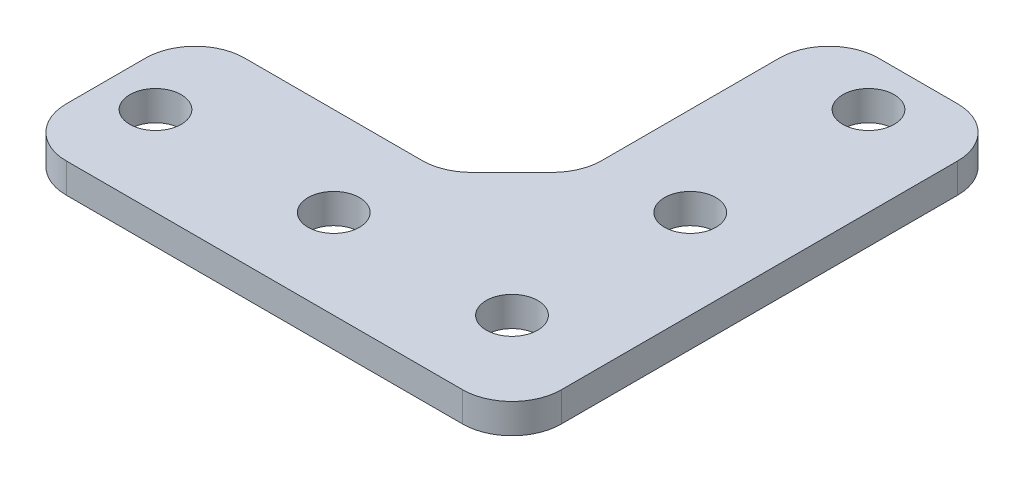
ISO-10303-21;
HEADER;
FILE_DESCRIPTION(('STEP AP214'),'2;1');
FILE_NAME('part.step','',(''),(''),'','','');
FILE_SCHEMA(('AUTOMOTIVE_DESIGN { 1 0 10303 214 1 1 1 1 }'));
ENDSEC;
DATA;
#1=APPLICATION_CONTEXT('core data for automotive mechanical design processes');
#2=APPLICATION_PROTOCOL_DEFINITION('international standard','automotive_design',2000,#1);
#3=PRODUCT_CONTEXT('',#1,'mechanical');
#4=PRODUCT('Part','Part','',(#3));
#5=PRODUCT_RELATED_PRODUCT_CATEGORY('part','',(#4));
#6=PRODUCT_DEFINITION_FORMATION('','',#4);
#7=PRODUCT_DEFINITION_CONTEXT('part definition',#1,'design');
#8=PRODUCT_DEFINITION('design','',#6,#7);
#9=PRODUCT_DEFINITION_SHAPE('','',#8);
#10=(LENGTH_UNIT() NAMED_UNIT(*) SI_UNIT(.MILLI.,.METRE.));
#11=(NAMED_UNIT(*) PLANE_ANGLE_UNIT() SI_UNIT($,.RADIAN.));
#12=(NAMED_UNIT(*) SI_UNIT($,.STERADIAN.) SOLID_ANGLE_UNIT());
#13=UNCERTAINTY_MEASURE_WITH_UNIT(LENGTH_MEASURE(1.E-05),#10,'distance_accuracy_value','');
#14=(GEOMETRIC_REPRESENTATION_CONTEXT(3) GLOBAL_UNCERTAINTY_ASSIGNED_CONTEXT((#13)) GLOBAL_UNIT_ASSIGNED_CONTEXT((#10,
#11,#12)) REPRESENTATION_CONTEXT('',''));
#15=CARTESIAN_POINT('',(0.,0.,0.));
#16=DIRECTION('',(0.,0.,1.));
#17=DIRECTION('',(1.,0.,0.));
#18=AXIS2_PLACEMENT_3D('',#15,#16,#17);
#19=CARTESIAN_POINT('',(25.,-3.,-25.));
#20=DIRECTION('',(1.,0.,0.));
#21=DIRECTION('',(0.,0.,-1.));
#22=AXIS2_PLACEMENT_3D('',#19,#20,#21);
#23=PLANE('',#22);
#24=DIRECTION('',(0.,0.,-1.));
#25=VECTOR('',#24,1.);
#26=CARTESIAN_POINT('',(25.,-3.,-25.));
#27=LINE('',#26,#25);
#28=CARTESIAN_POINT('',(25.,-3.,20.));
#29=VERTEX_POINT('',#28);
#30=CARTESIAN_POINT('',(25.,-3.,-20.));
#31=VERTEX_POINT('',#30);
#32=EDGE_CURVE('E243',#29,#31,#27,.T.);
#33=ORIENTED_EDGE('',*,*,#32,.T.);
#34=DIRECTION('',(0.,1.,0.));
#35=VECTOR('',#34,1.);
#36=CARTESIAN_POINT('',(25.,-3.,-20.));
#37=LINE('',#36,#35);
#38=CARTESIAN_POINT('',(25.,0.,-20.));
#39=VERTEX_POINT('',#38);
#40=EDGE_CURVE('E222',#31,#39,#37,.T.);
#41=ORIENTED_EDGE('',*,*,#40,.T.);
#42=DIRECTION('',(0.,0.,-1.));
#43=VECTOR('',#42,1.);
#44=CARTESIAN_POINT('',(25.,0.,-25.));
#45=LINE('',#44,#43);
#46=CARTESIAN_POINT('',(25.,0.,20.));
#47=VERTEX_POINT('',#46);
#48=EDGE_CURVE('E248',#47,#39,#45,.T.);
#49=ORIENTED_EDGE('',*,*,#48,.F.);
#50=DIRECTION('',(0.,1.,0.));
#51=VECTOR('',#50,1.);
#52=CARTESIAN_POINT('',(25.,-3.,20.));
#53=LINE('',#52,#51);
#54=EDGE_CURVE('E220',#47,#29,#53,.F.);
#55=ORIENTED_EDGE('',*,*,#54,.T.);
#56=EDGE_LOOP('',(#33,#41,#49,#55));
#57=FACE_BOUND('',#56,.T.);
#58=ADVANCED_FACE('F39',(#57),#23,.T.);
#59=CARTESIAN_POINT('',(-25.,-3.,25.));
#60=DIRECTION('',(0.,0.,1.));
#61=DIRECTION('',(1.,0.,0.));
#62=AXIS2_PLACEMENT_3D('',#59,#60,#61);
#63=PLANE('',#62);
#64=DIRECTION('',(1.,0.,0.));
#65=VECTOR('',#64,1.);
#66=CARTESIAN_POINT('',(-25.,-3.,25.));
#67=LINE('',#66,#65);
#68=CARTESIAN_POINT('',(-20.,-3.,25.));
#69=VERTEX_POINT('',#68);
#70=CARTESIAN_POINT('',(20.,-3.,25.));
#71=VERTEX_POINT('',#70);
#72=EDGE_CURVE('E170',#69,#71,#67,.T.);
#73=ORIENTED_EDGE('',*,*,#72,.T.);
#74=DIRECTION('',(0.,1.,0.));
#75=VECTOR('',#74,1.);
#76=CARTESIAN_POINT('',(20.,-3.,25.));
#77=LINE('',#76,#75);
#78=CARTESIAN_POINT('',(20.,0.,25.));
#79=VERTEX_POINT('',#78);
#80=EDGE_CURVE('E11',#71,#79,#77,.T.);
#81=ORIENTED_EDGE('',*,*,#80,.T.);
#82=DIRECTION('',(1.,0.,0.));
#83=VECTOR('',#82,1.);
#84=CARTESIAN_POINT('',(-25.,0.,25.));
#85=LINE('',#84,#83);
#86=CARTESIAN_POINT('',(-20.,0.,25.));
#87=VERTEX_POINT('',#86);
#88=EDGE_CURVE('E178',#87,#79,#85,.T.);
#89=ORIENTED_EDGE('',*,*,#88,.F.);
#90=DIRECTION('',(0.,1.,0.));
#91=VECTOR('',#90,1.);
#92=CARTESIAN_POINT('',(-20.,-3.,25.));
#93=LINE('',#92,#91);
#94=EDGE_CURVE('E47',#87,#69,#93,.F.);
#95=ORIENTED_EDGE('',*,*,#94,.T.);
#96=EDGE_LOOP('',(#73,#81,#89,#95));
#97=FACE_BOUND('',#96,.T.);
#98=ADVANCED_FACE('F227',(#97),#63,.T.);
#99=CARTESIAN_POINT('',(-25.,-3.,7.00000000000002));
#100=DIRECTION('',(-1.,0.,0.));
#101=DIRECTION('',(0.,0.,1.));
#102=AXIS2_PLACEMENT_3D('',#99,#100,#101);
#103=PLANE('',#102);
#104=DIRECTION('',(0.,0.,1.));
#105=VECTOR('',#104,1.);
#106=CARTESIAN_POINT('',(-25.,0.,7.00000000000002));
#107=LINE('',#106,#105);
#108=CARTESIAN_POINT('',(-25.,0.,12.));
#109=VERTEX_POINT('',#108);
#110=CARTESIAN_POINT('',(-25.,0.,20.));
#111=VERTEX_POINT('',#110);
#112=EDGE_CURVE('E239',#109,#111,#107,.T.);
#113=ORIENTED_EDGE('',*,*,#112,.F.);
#114=DIRECTION('',(0.,1.,0.));
#115=VECTOR('',#114,1.);
#116=CARTESIAN_POINT('',(-25.,-3.,12.));
#117=LINE('',#116,#115);
#118=CARTESIAN_POINT('',(-25.,-3.,12.));
#119=VERTEX_POINT('',#118);
#120=EDGE_CURVE('E218',#109,#119,#117,.F.);
#121=ORIENTED_EDGE('',*,*,#120,.T.);
#122=DIRECTION('',(0.,0.,1.));
#123=VECTOR('',#122,1.);
#124=CARTESIAN_POINT('',(-25.,-3.,7.00000000000002));
#125=LINE('',#124,#123);
#126=CARTESIAN_POINT('',(-25.,-3.,20.));
#127=VERTEX_POINT('',#126);
#128=EDGE_CURVE('E175',#119,#127,#125,.T.);
#129=ORIENTED_EDGE('',*,*,#128,.T.);
#130=DIRECTION('',(0.,1.,0.));
#131=VECTOR('',#130,1.);
#132=CARTESIAN_POINT('',(-25.,-3.,20.));
#133=LINE('',#132,#131);
#134=EDGE_CURVE('E215',#127,#111,#133,.T.);
#135=ORIENTED_EDGE('',*,*,#134,.T.);
#136=EDGE_LOOP('',(#113,#121,#129,#135));
#137=FACE_BOUND('',#136,.T.);
#138=ADVANCED_FACE('F238',(#137),#103,.T.);
#139=CARTESIAN_POINT('',(3.47658860459488E-13,-3.,7.00000000000002));
#140=DIRECTION('',(0.,0.,-1.));
#141=DIRECTION('',(-1.,0.,0.));
#142=AXIS2_PLACEMENT_3D('',#139,#140,#141);
#143=PLANE('',#142);
#144=DIRECTION('',(-1.,0.,0.));
#145=VECTOR('',#144,1.);
#146=CARTESIAN_POINT('',(3.47658860459488E-13,-3.,7.00000000000002));
#147=LINE('',#146,#145);
#148=CARTESIAN_POINT('',(-2.0710678118652,-3.,7.00000000000002));
#149=VERTEX_POINT('',#148);
#150=CARTESIAN_POINT('',(-20.,-3.,7.00000000000002));
#151=VERTEX_POINT('',#150);
#152=EDGE_CURVE('E253',#149,#151,#147,.T.);
#153=ORIENTED_EDGE('',*,*,#152,.T.);
#154=DIRECTION('',(0.,1.,0.));
#155=VECTOR('',#154,1.);
#156=CARTESIAN_POINT('',(-20.,-3.,7.00000000000002));
#157=LINE('',#156,#155);
#158=CARTESIAN_POINT('',(-20.,0.,7.00000000000002));
#159=VERTEX_POINT('',#158);
#160=EDGE_CURVE('E212',#151,#159,#157,.T.);
#161=ORIENTED_EDGE('',*,*,#160,.T.);
#162=DIRECTION('',(-1.,0.,0.));
#163=VECTOR('',#162,1.);
#164=CARTESIAN_POINT('',(3.47658860459488E-13,0.,7.00000000000002));
#165=LINE('',#164,#163);
#166=CARTESIAN_POINT('',(-2.0710678118652,0.,7.00000000000002));
#167=VERTEX_POINT('',#166);
#168=EDGE_CURVE('E242',#167,#159,#165,.T.);
#169=ORIENTED_EDGE('',*,*,#168,.F.);
#170=DIRECTION('',(0.,1.,0.));
#171=VECTOR('',#170,1.);
#172=CARTESIAN_POINT('',(-2.0710678118652,-3.,7.00000000000002));
#173=LINE('',#172,#171);
#174=EDGE_CURVE('E163',#167,#149,#173,.F.);
#175=ORIENTED_EDGE('',*,*,#174,.T.);
#176=EDGE_LOOP('',(#153,#161,#169,#175));
#177=FACE_BOUND('',#176,.T.);
#178=ADVANCED_FACE('F379',(#177),#143,.T.);
#179=CARTESIAN_POINT('',(6.99999999999999,-3.,0.));
#180=DIRECTION('',(-0.707106781186566,0.,-0.707106781186529));
#181=DIRECTION('',(-0.707106781186529,0.,0.707106781186566));
#182=AXIS2_PLACEMENT_3D('',#179,#180,#181);
#183=PLANE('',#182);
#184=DIRECTION('',(-0.707106781186529,0.,0.707106781186566));
#185=VECTOR('',#184,1.);
#186=CARTESIAN_POINT('',(6.99999999999999,0.,0.));
#187=LINE('',#186,#185);
#188=CARTESIAN_POINT('',(5.53553390593282,0.,1.46446609406726));
#189=VERTEX_POINT('',#188);
#190=CARTESIAN_POINT('',(1.46446609406762,0.,5.53553390593266));
#191=VERTEX_POINT('',#190);
#192=EDGE_CURVE('E152',#189,#191,#187,.T.);
#193=ORIENTED_EDGE('',*,*,#192,.F.);
#194=DIRECTION('',(0.,1.,0.));
#195=VECTOR('',#194,1.);
#196=CARTESIAN_POINT('',(5.53553390593282,-3.,1.46446609406726));
#197=LINE('',#196,#195);
#198=CARTESIAN_POINT('',(5.53553390593282,-3.,1.46446609406726));
#199=VERTEX_POINT('',#198);
#200=EDGE_CURVE('E161',#189,#199,#197,.F.);
#201=ORIENTED_EDGE('',*,*,#200,.T.);
#202=DIRECTION('',(-0.707106781186529,0.,0.707106781186566));
#203=VECTOR('',#202,1.);
#204=CARTESIAN_POINT('',(6.99999999999999,-3.,0.));
#205=LINE('',#204,#203);
#206=CARTESIAN_POINT('',(1.46446609406762,-3.,5.53553390593266));
#207=VERTEX_POINT('',#206);
#208=EDGE_CURVE('E255',#199,#207,#205,.T.);
#209=ORIENTED_EDGE('',*,*,#208,.T.);
#210=DIRECTION('',(0.,1.,0.));
#211=VECTOR('',#210,1.);
#212=CARTESIAN_POINT('',(1.46446609406763,0.,5.53553390593266));
#213=LINE('',#212,#211);
#214=EDGE_CURVE('E169',#207,#191,#213,.T.);
#215=ORIENTED_EDGE('',*,*,#214,.T.);
#216=EDGE_LOOP('',(#193,#201,#209,#215));
#217=FACE_BOUND('',#216,.T.);
#218=ADVANCED_FACE('F375',(#217),#183,.T.);
#219=CARTESIAN_POINT('',(6.99999999999999,-3.,-25.));
#220=DIRECTION('',(-1.,0.,0.));
#221=DIRECTION('',(0.,0.,1.));
#222=AXIS2_PLACEMENT_3D('',#219,#220,#221);
#223=PLANE('',#222);
#224=DIRECTION('',(0.,0.,1.));
#225=VECTOR('',#224,1.);
#226=CARTESIAN_POINT('',(6.99999999999999,0.,-25.));
#227=LINE('',#226,#225);
#228=CARTESIAN_POINT('',(6.99999999999999,0.,-20.));
#229=VERTEX_POINT('',#228);
#230=CARTESIAN_POINT('',(6.99999999999999,0.,-2.07106781186539));
#231=VERTEX_POINT('',#230);
#232=EDGE_CURVE('E141',#229,#231,#227,.T.);
#233=ORIENTED_EDGE('',*,*,#232,.F.);
#234=DIRECTION('',(0.,1.,0.));
#235=VECTOR('',#234,1.);
#236=CARTESIAN_POINT('',(6.99999999999999,-3.,-20.));
#237=LINE('',#236,#235);
#238=CARTESIAN_POINT('',(6.99999999999999,-3.,-20.));
#239=VERTEX_POINT('',#238);
#240=EDGE_CURVE('E202',#229,#239,#237,.F.);
#241=ORIENTED_EDGE('',*,*,#240,.T.);
#242=DIRECTION('',(0.,0.,1.));
#243=VECTOR('',#242,1.);
#244=CARTESIAN_POINT('',(6.99999999999999,-3.,-25.));
#245=LINE('',#244,#243);
#246=CARTESIAN_POINT('',(6.99999999999999,-3.,-2.07106781186539));
#247=VERTEX_POINT('',#246);
#248=EDGE_CURVE('E167',#239,#247,#245,.T.);
#249=ORIENTED_EDGE('',*,*,#248,.T.);
#250=DIRECTION('',(0.,1.,0.));
#251=VECTOR('',#250,1.);
#252=CARTESIAN_POINT('',(6.99999999999999,0.,-2.07106781186539));
#253=LINE('',#252,#251);
#254=EDGE_CURVE('E160',#247,#231,#253,.T.);
#255=ORIENTED_EDGE('',*,*,#254,.T.);
#256=EDGE_LOOP('',(#233,#241,#249,#255));
#257=FACE_BOUND('',#256,.T.);
#258=ADVANCED_FACE('F165',(#257),#223,.T.);
#259=CARTESIAN_POINT('',(6.99999999999999,-3.,-25.));
#260=DIRECTION('',(0.,0.,-1.));
#261=DIRECTION('',(-1.,0.,0.));
#262=AXIS2_PLACEMENT_3D('',#259,#260,#261);
#263=PLANE('',#262);
#264=DIRECTION('',(-1.,0.,0.));
#265=VECTOR('',#264,1.);
#266=CARTESIAN_POINT('',(6.99999999999999,-3.,-25.));
#267=LINE('',#266,#265);
#268=CARTESIAN_POINT('',(20.,-3.,-25.));
#269=VERTEX_POINT('',#268);
#270=CARTESIAN_POINT('',(12.,-3.,-25.));
#271=VERTEX_POINT('',#270);
#272=EDGE_CURVE('E259',#269,#271,#267,.T.);
#273=ORIENTED_EDGE('',*,*,#272,.T.);
#274=DIRECTION('',(0.,1.,0.));
#275=VECTOR('',#274,1.);
#276=CARTESIAN_POINT('',(12.,-3.,-25.));
#277=LINE('',#276,#275);
#278=CARTESIAN_POINT('',(12.,0.,-25.));
#279=VERTEX_POINT('',#278);
#280=EDGE_CURVE('E190',#271,#279,#277,.T.);
#281=ORIENTED_EDGE('',*,*,#280,.T.);
#282=DIRECTION('',(-1.,0.,0.));
#283=VECTOR('',#282,1.);
#284=CARTESIAN_POINT('',(6.99999999999999,0.,-25.));
#285=LINE('',#284,#283);
#286=CARTESIAN_POINT('',(20.,0.,-25.));
#287=VERTEX_POINT('',#286);
#288=EDGE_CURVE('E153',#287,#279,#285,.T.);
#289=ORIENTED_EDGE('',*,*,#288,.F.);
#290=DIRECTION('',(0.,1.,0.));
#291=VECTOR('',#290,1.);
#292=CARTESIAN_POINT('',(20.,-3.,-25.));
#293=LINE('',#292,#291);
#294=EDGE_CURVE('E188',#287,#269,#293,.F.);
#295=ORIENTED_EDGE('',*,*,#294,.T.);
#296=EDGE_LOOP('',(#273,#281,#289,#295));
#297=FACE_BOUND('',#296,.T.);
#298=ADVANCED_FACE('F336',(#297),#263,.T.);
#299=CARTESIAN_POINT('',(0.,-3.,0.));
#300=DIRECTION('',(0.,1.,0.));
#301=DIRECTION('',(0.,0.,1.));
#302=AXIS2_PLACEMENT_3D('',#299,#300,#301);
#303=PLANE('',#302);
#304=CARTESIAN_POINT('',(16.,-3.,-20.));
#305=DIRECTION('',(0.,1.,0.));
#306=DIRECTION('',(0.,0.,1.));
#307=AXIS2_PLACEMENT_3D('',#304,#305,#306);
#308=CIRCLE('',#307,2.6);
#309=CARTESIAN_POINT('',(16.,-3.,-17.4));
#310=VERTEX_POINT('',#309);
#311=EDGE_CURVE('E285',#310,#310,#308,.T.);
#312=ORIENTED_EDGE('',*,*,#311,.T.);
#313=EDGE_LOOP('',(#312));
#314=FACE_BOUND('',#313,.T.);
#315=CARTESIAN_POINT('',(16.,-3.,-1.99999999999998));
#316=DIRECTION('',(0.,1.,0.));
#317=DIRECTION('',(0.,0.,1.));
#318=AXIS2_PLACEMENT_3D('',#315,#316,#317);
#319=CIRCLE('',#318,2.6);
#320=CARTESIAN_POINT('',(16.,-3.,0.600000000000015));
#321=VERTEX_POINT('',#320);
#322=EDGE_CURVE('E279',#321,#321,#319,.T.);
#323=ORIENTED_EDGE('',*,*,#322,.T.);
#324=EDGE_LOOP('',(#323));
#325=FACE_BOUND('',#324,.T.);
#326=CARTESIAN_POINT('',(-20.,-3.,16.));
#327=DIRECTION('',(0.,1.,0.));
#328=DIRECTION('',(0.,0.,1.));
#329=AXIS2_PLACEMENT_3D('',#326,#327,#328);
#330=CIRCLE('',#329,2.6);
#331=CARTESIAN_POINT('',(-20.,-3.,18.6));
#332=VERTEX_POINT('',#331);
#333=EDGE_CURVE('E273',#332,#332,#330,.T.);
#334=ORIENTED_EDGE('',*,*,#333,.T.);
#335=EDGE_LOOP('',(#334));
#336=FACE_BOUND('',#335,.T.);
#337=CARTESIAN_POINT('',(-2.00000000000001,-3.,16.));
#338=DIRECTION('',(0.,1.,0.));
#339=DIRECTION('',(0.,0.,1.));
#340=AXIS2_PLACEMENT_3D('',#337,#338,#339);
#341=CIRCLE('',#340,2.6);
#342=CARTESIAN_POINT('',(-2.00000000000001,-3.,18.6));
#343=VERTEX_POINT('',#342);
#344=EDGE_CURVE('E267',#343,#343,#341,.T.);
#345=ORIENTED_EDGE('',*,*,#344,.T.);
#346=EDGE_LOOP('',(#345));
#347=FACE_BOUND('',#346,.T.);
#348=CARTESIAN_POINT('',(16.,-3.,16.));
#349=DIRECTION('',(0.,1.,0.));
#350=DIRECTION('',(0.,0.,1.));
#351=AXIS2_PLACEMENT_3D('',#348,#349,#350);
#352=CIRCLE('',#351,2.6);
#353=CARTESIAN_POINT('',(16.,-3.,18.6));
#354=VERTEX_POINT('',#353);
#355=EDGE_CURVE('E250',#354,#354,#352,.T.);
#356=ORIENTED_EDGE('',*,*,#355,.T.);
#357=EDGE_LOOP('',(#356));
#358=FACE_BOUND('',#357,.T.);
#359=ORIENTED_EDGE('',*,*,#248,.F.);
#360=CARTESIAN_POINT('',(12.,-3.,-20.));
#361=DIRECTION('',(0.,1.,0.));
#362=DIRECTION('',(0.,0.,1.));
#363=AXIS2_PLACEMENT_3D('',#360,#361,#362);
#364=CIRCLE('',#363,5.);
#365=EDGE_CURVE('E210',#239,#271,#364,.F.);
#366=ORIENTED_EDGE('',*,*,#365,.T.);
#367=ORIENTED_EDGE('',*,*,#272,.F.);
#368=CARTESIAN_POINT('',(20.,-3.,-20.));
#369=DIRECTION('',(0.,1.,0.));
#370=DIRECTION('',(0.,0.,1.));
#371=AXIS2_PLACEMENT_3D('',#368,#369,#370);
#372=CIRCLE('',#371,5.);
#373=EDGE_CURVE('E207',#269,#31,#372,.F.);
#374=ORIENTED_EDGE('',*,*,#373,.T.);
#375=ORIENTED_EDGE('',*,*,#32,.F.);
#376=CARTESIAN_POINT('',(20.,-3.,20.));
#377=DIRECTION('',(0.,1.,0.));
#378=DIRECTION('',(0.,0.,1.));
#379=AXIS2_PLACEMENT_3D('',#376,#377,#378);
#380=CIRCLE('',#379,5.);
#381=EDGE_CURVE('E205',#29,#71,#380,.F.);
#382=ORIENTED_EDGE('',*,*,#381,.T.);
#383=ORIENTED_EDGE('',*,*,#72,.F.);
#384=CARTESIAN_POINT('',(-20.,-3.,20.));
#385=DIRECTION('',(0.,1.,0.));
#386=DIRECTION('',(0.,0.,1.));
#387=AXIS2_PLACEMENT_3D('',#384,#385,#386);
#388=CIRCLE('',#387,5.);
#389=EDGE_CURVE('E60',#69,#127,#388,.F.);
#390=ORIENTED_EDGE('',*,*,#389,.T.);
#391=ORIENTED_EDGE('',*,*,#128,.F.);
#392=CARTESIAN_POINT('',(-20.,-3.,12.));
#393=DIRECTION('',(0.,1.,0.));
#394=DIRECTION('',(0.,0.,1.));
#395=AXIS2_PLACEMENT_3D('',#392,#393,#394);
#396=CIRCLE('',#395,5.);
#397=EDGE_CURVE('E54',#119,#151,#396,.F.);
#398=ORIENTED_EDGE('',*,*,#397,.T.);
#399=ORIENTED_EDGE('',*,*,#152,.F.);
#400=CARTESIAN_POINT('',(-2.0710678118652,-3.,2.00000000000002));
#401=DIRECTION('',(0.,1.,0.));
#402=DIRECTION('',(0.,0.,1.));
#403=AXIS2_PLACEMENT_3D('',#400,#401,#402);
#404=CIRCLE('',#403,5.);
#405=EDGE_CURVE('E186',#149,#207,#404,.T.);
#406=ORIENTED_EDGE('',*,*,#405,.T.);
#407=ORIENTED_EDGE('',*,*,#208,.F.);
#408=CARTESIAN_POINT('',(1.99999999999999,-3.,-2.07106781186539));
#409=DIRECTION('',(0.,1.,0.));
#410=DIRECTION('',(0.,0.,1.));
#411=AXIS2_PLACEMENT_3D('',#408,#409,#410);
#412=CIRCLE('',#411,5.);
#413=EDGE_CURVE('E162',#199,#247,#412,.T.);
#414=ORIENTED_EDGE('',*,*,#413,.T.);
#415=EDGE_LOOP('',(#359,#366,#367,#374,#375,#382,#383,#390,#391,#398,#399,#406,#407,#414));
#416=FACE_BOUND('',#415,.T.);
#417=ADVANCED_FACE('F231',(#314,#325,#336,#347,#358,#416),#303,.F.);
#418=CARTESIAN_POINT('',(0.,0.,0.));
#419=DIRECTION('',(0.,1.,0.));
#420=DIRECTION('',(0.,0.,1.));
#421=AXIS2_PLACEMENT_3D('',#418,#419,#420);
#422=PLANE('',#421);
#423=CARTESIAN_POINT('',(16.,0.,-20.));
#424=DIRECTION('',(0.,1.,0.));
#425=DIRECTION('',(0.,0.,1.));
#426=AXIS2_PLACEMENT_3D('',#423,#424,#425);
#427=CIRCLE('',#426,2.6);
#428=CARTESIAN_POINT('',(16.,0.,-17.4));
#429=VERTEX_POINT('',#428);
#430=EDGE_CURVE('E288',#429,#429,#427,.T.);
#431=ORIENTED_EDGE('',*,*,#430,.F.);
#432=EDGE_LOOP('',(#431));
#433=FACE_BOUND('',#432,.T.);
#434=CARTESIAN_POINT('',(16.,0.,-1.99999999999998));
#435=DIRECTION('',(0.,1.,0.));
#436=DIRECTION('',(0.,0.,1.));
#437=AXIS2_PLACEMENT_3D('',#434,#435,#436);
#438=CIRCLE('',#437,2.6);
#439=CARTESIAN_POINT('',(16.,0.,0.600000000000015));
#440=VERTEX_POINT('',#439);
#441=EDGE_CURVE('E282',#440,#440,#438,.T.);
#442=ORIENTED_EDGE('',*,*,#441,.F.);
#443=EDGE_LOOP('',(#442));
#444=FACE_BOUND('',#443,.T.);
#445=CARTESIAN_POINT('',(-20.,0.,16.));
#446=DIRECTION('',(0.,1.,0.));
#447=DIRECTION('',(0.,0.,1.));
#448=AXIS2_PLACEMENT_3D('',#445,#446,#447);
#449=CIRCLE('',#448,2.6);
#450=CARTESIAN_POINT('',(-20.,0.,18.6));
#451=VERTEX_POINT('',#450);
#452=EDGE_CURVE('E276',#451,#451,#449,.T.);
#453=ORIENTED_EDGE('',*,*,#452,.F.);
#454=EDGE_LOOP('',(#453));
#455=FACE_BOUND('',#454,.T.);
#456=CARTESIAN_POINT('',(-2.00000000000001,0.,16.));
#457=DIRECTION('',(0.,1.,0.));
#458=DIRECTION('',(0.,0.,1.));
#459=AXIS2_PLACEMENT_3D('',#456,#457,#458);
#460=CIRCLE('',#459,2.6);
#461=CARTESIAN_POINT('',(-2.00000000000001,0.,18.6));
#462=VERTEX_POINT('',#461);
#463=EDGE_CURVE('E270',#462,#462,#460,.T.);
#464=ORIENTED_EDGE('',*,*,#463,.F.);
#465=EDGE_LOOP('',(#464));
#466=FACE_BOUND('',#465,.T.);
#467=CARTESIAN_POINT('',(16.,0.,16.));
#468=DIRECTION('',(0.,1.,0.));
#469=DIRECTION('',(0.,0.,1.));
#470=AXIS2_PLACEMENT_3D('',#467,#468,#469);
#471=CIRCLE('',#470,2.6);
#472=CARTESIAN_POINT('',(16.,0.,18.6));
#473=VERTEX_POINT('',#472);
#474=EDGE_CURVE('E264',#473,#473,#471,.T.);
#475=ORIENTED_EDGE('',*,*,#474,.F.);
#476=EDGE_LOOP('',(#475));
#477=FACE_BOUND('',#476,.T.);
#478=ORIENTED_EDGE('',*,*,#288,.T.);
#479=CARTESIAN_POINT('',(12.,0.,-20.));
#480=DIRECTION('',(0.,1.,0.));
#481=DIRECTION('',(0.,0.,1.));
#482=AXIS2_PLACEMENT_3D('',#479,#480,#481);
#483=CIRCLE('',#482,5.);
#484=EDGE_CURVE('E148',#279,#229,#483,.T.);
#485=ORIENTED_EDGE('',*,*,#484,.T.);
#486=ORIENTED_EDGE('',*,*,#232,.T.);
#487=CARTESIAN_POINT('',(1.99999999999999,0.,-2.07106781186539));
#488=DIRECTION('',(0.,1.,0.));
#489=DIRECTION('',(0.,0.,1.));
#490=AXIS2_PLACEMENT_3D('',#487,#488,#489);
#491=CIRCLE('',#490,5.);
#492=EDGE_CURVE('E146',#231,#189,#491,.F.);
#493=ORIENTED_EDGE('',*,*,#492,.T.);
#494=ORIENTED_EDGE('',*,*,#192,.T.);
#495=CARTESIAN_POINT('',(-2.0710678118652,0.,2.00000000000002));
#496=DIRECTION('',(0.,1.,0.));
#497=DIRECTION('',(0.,0.,1.));
#498=AXIS2_PLACEMENT_3D('',#495,#496,#497);
#499=CIRCLE('',#498,5.);
#500=EDGE_CURVE('E184',#191,#167,#499,.F.);
#501=ORIENTED_EDGE('',*,*,#500,.T.);
#502=ORIENTED_EDGE('',*,*,#168,.T.);
#503=CARTESIAN_POINT('',(-20.,0.,12.));
#504=DIRECTION('',(0.,1.,0.));
#505=DIRECTION('',(0.,0.,1.));
#506=AXIS2_PLACEMENT_3D('',#503,#504,#505);
#507=CIRCLE('',#506,5.);
#508=EDGE_CURVE('E199',#159,#109,#507,.T.);
#509=ORIENTED_EDGE('',*,*,#508,.T.);
#510=ORIENTED_EDGE('',*,*,#112,.T.);
#511=CARTESIAN_POINT('',(-20.,0.,20.));
#512=DIRECTION('',(0.,1.,0.));
#513=DIRECTION('',(0.,0.,1.));
#514=AXIS2_PLACEMENT_3D('',#511,#512,#513);
#515=CIRCLE('',#514,5.);
#516=EDGE_CURVE('E193',#111,#87,#515,.T.);
#517=ORIENTED_EDGE('',*,*,#516,.T.);
#518=ORIENTED_EDGE('',*,*,#88,.T.);
#519=CARTESIAN_POINT('',(20.,0.,20.));
#520=DIRECTION('',(0.,1.,0.));
#521=DIRECTION('',(0.,0.,1.));
#522=AXIS2_PLACEMENT_3D('',#519,#520,#521);
#523=CIRCLE('',#522,5.);
#524=EDGE_CURVE('E195',#79,#47,#523,.T.);
#525=ORIENTED_EDGE('',*,*,#524,.T.);
#526=ORIENTED_EDGE('',*,*,#48,.T.);
#527=CARTESIAN_POINT('',(20.,0.,-20.));
#528=DIRECTION('',(0.,1.,0.));
#529=DIRECTION('',(0.,0.,1.));
#530=AXIS2_PLACEMENT_3D('',#527,#528,#529);
#531=CIRCLE('',#530,5.);
#532=EDGE_CURVE('E197',#39,#287,#531,.T.);
#533=ORIENTED_EDGE('',*,*,#532,.T.);
#534=EDGE_LOOP('',(#478,#485,#486,#493,#494,#501,#502,#509,#510,#517,#518,#525,#526,#533));
#535=FACE_BOUND('',#534,.T.);
#536=ADVANCED_FACE('F144',(#433,#444,#455,#466,#477,#535),#422,.T.);
#537=CARTESIAN_POINT('',(16.,-3.,16.));
#538=DIRECTION('',(0.,1.,0.));
#539=DIRECTION('',(0.,0.,1.));
#540=AXIS2_PLACEMENT_3D('',#537,#538,#539);
#541=CYLINDRICAL_SURFACE('',#540,2.6);
#542=ORIENTED_EDGE('',*,*,#355,.F.);
#543=EDGE_LOOP('',(#542));
#544=FACE_BOUND('',#543,.T.);
#545=ORIENTED_EDGE('',*,*,#474,.T.);
#546=EDGE_LOOP('',(#545));
#547=FACE_BOUND('',#546,.T.);
#548=ADVANCED_FACE('F305',(#544,#547),#541,.F.);
#549=CARTESIAN_POINT('',(-2.00000000000001,-3.,16.));
#550=DIRECTION('',(0.,1.,0.));
#551=DIRECTION('',(0.,0.,1.));
#552=AXIS2_PLACEMENT_3D('',#549,#550,#551);
#553=CYLINDRICAL_SURFACE('',#552,2.6);
#554=ORIENTED_EDGE('',*,*,#344,.F.);
#555=EDGE_LOOP('',(#554));
#556=FACE_BOUND('',#555,.T.);
#557=ORIENTED_EDGE('',*,*,#463,.T.);
#558=EDGE_LOOP('',(#557));
#559=FACE_BOUND('',#558,.T.);
#560=ADVANCED_FACE('F316',(#556,#559),#553,.F.);
#561=CARTESIAN_POINT('',(-20.,-3.,16.));
#562=DIRECTION('',(0.,1.,0.));
#563=DIRECTION('',(0.,0.,1.));
#564=AXIS2_PLACEMENT_3D('',#561,#562,#563);
#565=CYLINDRICAL_SURFACE('',#564,2.6);
#566=ORIENTED_EDGE('',*,*,#333,.F.);
#567=EDGE_LOOP('',(#566));
#568=FACE_BOUND('',#567,.T.);
#569=ORIENTED_EDGE('',*,*,#452,.T.);
#570=EDGE_LOOP('',(#569));
#571=FACE_BOUND('',#570,.T.);
#572=ADVANCED_FACE('F322',(#568,#571),#565,.F.);
#573=CARTESIAN_POINT('',(16.,-3.,-1.99999999999998));
#574=DIRECTION('',(0.,1.,0.));
#575=DIRECTION('',(0.,0.,1.));
#576=AXIS2_PLACEMENT_3D('',#573,#574,#575);
#577=CYLINDRICAL_SURFACE('',#576,2.6);
#578=ORIENTED_EDGE('',*,*,#322,.F.);
#579=EDGE_LOOP('',(#578));
#580=FACE_BOUND('',#579,.T.);
#581=ORIENTED_EDGE('',*,*,#441,.T.);
#582=EDGE_LOOP('',(#581));
#583=FACE_BOUND('',#582,.T.);
#584=ADVANCED_FACE('F299',(#580,#583),#577,.F.);
#585=CARTESIAN_POINT('',(16.,-3.,-20.));
#586=DIRECTION('',(0.,1.,0.));
#587=DIRECTION('',(0.,0.,1.));
#588=AXIS2_PLACEMENT_3D('',#585,#586,#587);
#589=CYLINDRICAL_SURFACE('',#588,2.6);
#590=ORIENTED_EDGE('',*,*,#311,.F.);
#591=EDGE_LOOP('',(#590));
#592=FACE_BOUND('',#591,.T.);
#593=ORIENTED_EDGE('',*,*,#430,.T.);
#594=EDGE_LOOP('',(#593));
#595=FACE_BOUND('',#594,.T.);
#596=ADVANCED_FACE('F296',(#592,#595),#589,.F.);
#597=CARTESIAN_POINT('',(1.99999999999999,-3.,-2.07106781186539));
#598=DIRECTION('',(0.,-1.,0.));
#599=DIRECTION('',(0.,0.,-1.));
#600=AXIS2_PLACEMENT_3D('',#597,#598,#599);
#601=CYLINDRICAL_SURFACE('',#600,5.);
#602=ORIENTED_EDGE('',*,*,#413,.F.);
#603=ORIENTED_EDGE('',*,*,#200,.F.);
#604=ORIENTED_EDGE('',*,*,#492,.F.);
#605=ORIENTED_EDGE('',*,*,#254,.F.);
#606=EDGE_LOOP('',(#602,#603,#604,#605));
#607=FACE_BOUND('',#606,.T.);
#608=ADVANCED_FACE('F159',(#607),#601,.F.);
#609=CARTESIAN_POINT('',(-2.0710678118652,-3.,2.00000000000002));
#610=DIRECTION('',(0.,-1.,0.));
#611=DIRECTION('',(0.,0.,-1.));
#612=AXIS2_PLACEMENT_3D('',#609,#610,#611);
#613=CYLINDRICAL_SURFACE('',#612,5.);
#614=ORIENTED_EDGE('',*,*,#405,.F.);
#615=ORIENTED_EDGE('',*,*,#174,.F.);
#616=ORIENTED_EDGE('',*,*,#500,.F.);
#617=ORIENTED_EDGE('',*,*,#214,.F.);
#618=EDGE_LOOP('',(#614,#615,#616,#617));
#619=FACE_BOUND('',#618,.T.);
#620=ADVANCED_FACE('F340',(#619),#613,.F.);
#621=CARTESIAN_POINT('',(12.,-3.,-20.));
#622=DIRECTION('',(0.,1.,0.));
#623=DIRECTION('',(0.,0.,1.));
#624=AXIS2_PLACEMENT_3D('',#621,#622,#623);
#625=CYLINDRICAL_SURFACE('',#624,5.);
#626=ORIENTED_EDGE('',*,*,#365,.F.);
#627=ORIENTED_EDGE('',*,*,#240,.F.);
#628=ORIENTED_EDGE('',*,*,#484,.F.);
#629=ORIENTED_EDGE('',*,*,#280,.F.);
#630=EDGE_LOOP('',(#626,#627,#628,#629));
#631=FACE_BOUND('',#630,.T.);
#632=ADVANCED_FACE('F343',(#631),#625,.T.);
#633=CARTESIAN_POINT('',(-20.,-3.,12.));
#634=DIRECTION('',(0.,1.,0.));
#635=DIRECTION('',(0.,0.,1.));
#636=AXIS2_PLACEMENT_3D('',#633,#634,#635);
#637=CYLINDRICAL_SURFACE('',#636,5.);
#638=ORIENTED_EDGE('',*,*,#397,.F.);
#639=ORIENTED_EDGE('',*,*,#120,.F.);
#640=ORIENTED_EDGE('',*,*,#508,.F.);
#641=ORIENTED_EDGE('',*,*,#160,.F.);
#642=EDGE_LOOP('',(#638,#639,#640,#641));
#643=FACE_BOUND('',#642,.T.);
#644=ADVANCED_FACE('F347',(#643),#637,.T.);
#645=CARTESIAN_POINT('',(20.,-3.,-20.));
#646=DIRECTION('',(0.,1.,0.));
#647=DIRECTION('',(0.,0.,1.));
#648=AXIS2_PLACEMENT_3D('',#645,#646,#647);
#649=CYLINDRICAL_SURFACE('',#648,5.);
#650=ORIENTED_EDGE('',*,*,#373,.F.);
#651=ORIENTED_EDGE('',*,*,#294,.F.);
#652=ORIENTED_EDGE('',*,*,#532,.F.);
#653=ORIENTED_EDGE('',*,*,#40,.F.);
#654=EDGE_LOOP('',(#650,#651,#652,#653));
#655=FACE_BOUND('',#654,.T.);
#656=ADVANCED_FACE('F351',(#655),#649,.T.);
#657=CARTESIAN_POINT('',(20.,-3.,20.));
#658=DIRECTION('',(0.,1.,0.));
#659=DIRECTION('',(0.,0.,1.));
#660=AXIS2_PLACEMENT_3D('',#657,#658,#659);
#661=CYLINDRICAL_SURFACE('',#660,5.);
#662=ORIENTED_EDGE('',*,*,#381,.F.);
#663=ORIENTED_EDGE('',*,*,#54,.F.);
#664=ORIENTED_EDGE('',*,*,#524,.F.);
#665=ORIENTED_EDGE('',*,*,#80,.F.);
#666=EDGE_LOOP('',(#662,#663,#664,#665));
#667=FACE_BOUND('',#666,.T.);
#668=ADVANCED_FACE('F354',(#667),#661,.T.);
#669=CARTESIAN_POINT('',(-20.,-3.,20.));
#670=DIRECTION('',(0.,1.,0.));
#671=DIRECTION('',(0.,0.,1.));
#672=AXIS2_PLACEMENT_3D('',#669,#670,#671);
#673=CYLINDRICAL_SURFACE('',#672,5.);
#674=ORIENTED_EDGE('',*,*,#389,.F.);
#675=ORIENTED_EDGE('',*,*,#94,.F.);
#676=ORIENTED_EDGE('',*,*,#516,.F.);
#677=ORIENTED_EDGE('',*,*,#134,.F.);
#678=EDGE_LOOP('',(#674,#675,#676,#677));
#679=FACE_BOUND('',#678,.T.);
#680=ADVANCED_FACE('F41',(#679),#673,.T.);
#681=CLOSED_SHELL('',(#58,#98,#138,#178,#218,#258,#298,#417,#536,#548,#560,#572,#584,#596,#608,
#620,#632,#644,#656,#668,#680));
#682=MANIFOLD_SOLID_BREP('B2',#681);
#683=ADVANCED_BREP_SHAPE_REPRESENTATION('',(#18,#682),#14);
#684=SHAPE_DEFINITION_REPRESENTATION(#9,#683);
ENDSEC;
END-ISO-10303-21;
